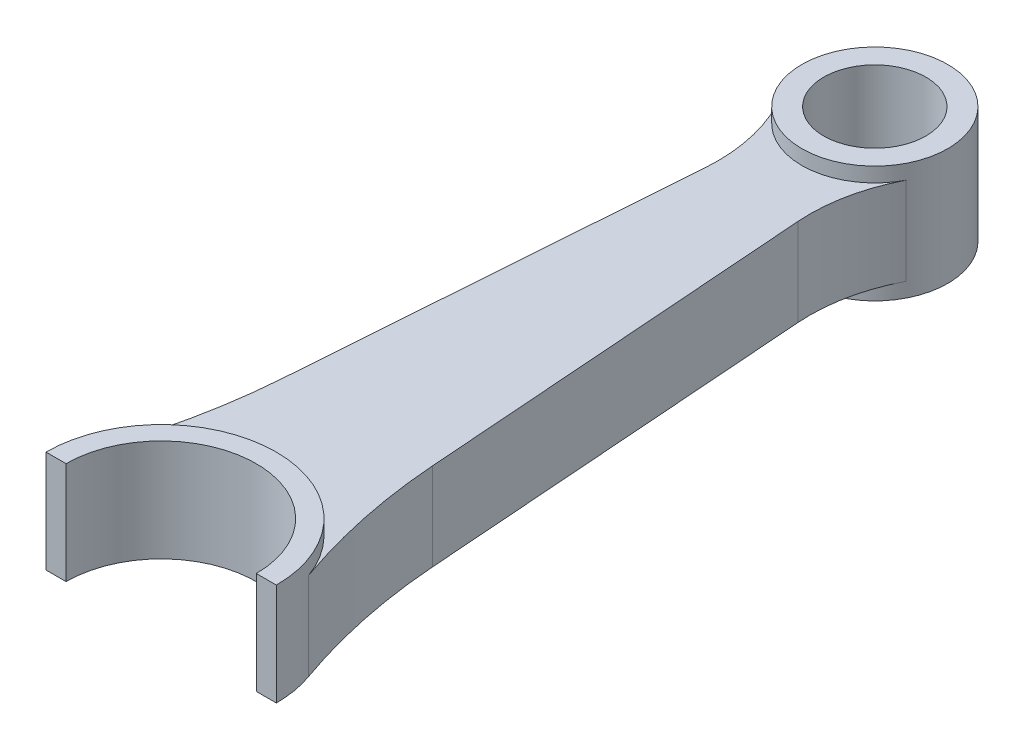
ISO-10303-21;
HEADER;
FILE_DESCRIPTION(('STEP AP214'),'2;1');
FILE_NAME('part.step','',(''),(''),'','','');
FILE_SCHEMA(('AUTOMOTIVE_DESIGN { 1 0 10303 214 1 1 1 1 }'));
ENDSEC;
DATA;
#1=APPLICATION_CONTEXT('core data for automotive mechanical design processes');
#2=APPLICATION_PROTOCOL_DEFINITION('international standard','automotive_design',2000,#1);
#3=PRODUCT_CONTEXT('',#1,'mechanical');
#4=PRODUCT('Part','Part','',(#3));
#5=PRODUCT_RELATED_PRODUCT_CATEGORY('part','',(#4));
#6=PRODUCT_DEFINITION_FORMATION('','',#4);
#7=PRODUCT_DEFINITION_CONTEXT('part definition',#1,'design');
#8=PRODUCT_DEFINITION('design','',#6,#7);
#9=PRODUCT_DEFINITION_SHAPE('','',#8);
#10=(LENGTH_UNIT() NAMED_UNIT(*) SI_UNIT(.MILLI.,.METRE.));
#11=(NAMED_UNIT(*) PLANE_ANGLE_UNIT() SI_UNIT($,.RADIAN.));
#12=(NAMED_UNIT(*) SI_UNIT($,.STERADIAN.) SOLID_ANGLE_UNIT());
#13=UNCERTAINTY_MEASURE_WITH_UNIT(LENGTH_MEASURE(1.E-05),#10,'distance_accuracy_value','');
#14=(GEOMETRIC_REPRESENTATION_CONTEXT(3) GLOBAL_UNCERTAINTY_ASSIGNED_CONTEXT((#13)) GLOBAL_UNIT_ASSIGNED_CONTEXT((#10,
#11,#12)) REPRESENTATION_CONTEXT('',''));
#15=CARTESIAN_POINT('',(0.,0.,0.));
#16=DIRECTION('',(0.,0.,1.));
#17=DIRECTION('',(1.,0.,0.));
#18=AXIS2_PLACEMENT_3D('',#15,#16,#17);
#19=CARTESIAN_POINT('',(0.,3.,0.));
#20=DIRECTION('',(0.,1.,0.));
#21=DIRECTION('',(0.,0.,1.));
#22=AXIS2_PLACEMENT_3D('',#19,#20,#21);
#23=PLANE('',#22);
#24=CARTESIAN_POINT('',(-46.2676943878692,3.,32.4495738727453));
#25=DIRECTION('',(0.,1.,0.));
#26=DIRECTION('',(0.,0.,1.));
#27=AXIS2_PLACEMENT_3D('',#24,#25,#26);
#28=CIRCLE('',#27,41.2123461748534);
#29=CARTESIAN_POINT('',(-5.16600758923558,3.,35.4676559695388));
#30=VERTEX_POINT('',#29);
#31=CARTESIAN_POINT('',(-7.43504926891974,3.,46.2511372009223));
#32=VERTEX_POINT('',#31);
#33=EDGE_CURVE('E181',#30,#32,#28,.F.);
#34=ORIENTED_EDGE('',*,*,#33,.T.);
#35=CARTESIAN_POINT('',(0.,3.,48.8936381950932));
#36=DIRECTION('',(0.,1.,0.));
#37=DIRECTION('',(0.,0.,1.));
#38=AXIS2_PLACEMENT_3D('',#35,#36,#37);
#39=CIRCLE('',#38,7.89067608861614);
#40=CARTESIAN_POINT('',(7.43504926891975,3.,46.2511372009223));
#41=VERTEX_POINT('',#40);
#42=EDGE_CURVE('E11',#32,#41,#39,.F.);
#43=ORIENTED_EDGE('',*,*,#42,.T.);
#44=CARTESIAN_POINT('',(46.2676943878693,3.,32.4495738727453));
#45=DIRECTION('',(0.,1.,0.));
#46=DIRECTION('',(0.,0.,1.));
#47=AXIS2_PLACEMENT_3D('',#44,#45,#46);
#48=CIRCLE('',#47,41.2123461748534);
#49=CARTESIAN_POINT('',(5.16600758923572,3.,35.4676559695389));
#50=VERTEX_POINT('',#49);
#51=EDGE_CURVE('E184',#50,#41,#48,.T.);
#52=ORIENTED_EDGE('',*,*,#51,.F.);
#53=DIRECTION('',(0.0732324746567138,0.,0.997314897439948));
#54=VECTOR('',#53,1.);
#55=CARTESIAN_POINT('',(2.54789234067379,3.,-0.187090819304305));
#56=LINE('',#55,#54);
#57=CARTESIAN_POINT('',(3.18274456382503,3.,8.45863066955105));
#58=VERTEX_POINT('',#57);
#59=EDGE_CURVE('E188',#58,#50,#56,.T.);
#60=ORIENTED_EDGE('',*,*,#59,.F.);
#61=CARTESIAN_POINT('',(14.741104148824,3.,7.60990447729783));
#62=DIRECTION('',(0.,1.,0.));
#63=DIRECTION('',(0.,0.,1.));
#64=AXIS2_PLACEMENT_3D('',#61,#62,#63);
#65=CIRCLE('',#64,11.5894785234519);
#66=CARTESIAN_POINT('',(4.4429076320829,3.,2.2935936372382));
#67=VERTEX_POINT('',#66);
#68=EDGE_CURVE('E192',#58,#67,#65,.F.);
#69=ORIENTED_EDGE('',*,*,#68,.T.);
#70=CARTESIAN_POINT('',(0.,3.,0.));
#71=DIRECTION('',(0.,1.,0.));
#72=DIRECTION('',(0.,0.,1.));
#73=AXIS2_PLACEMENT_3D('',#70,#71,#72);
#74=CIRCLE('',#73,5.);
#75=CARTESIAN_POINT('',(-4.44290763208289,3.,2.2935936372382));
#76=VERTEX_POINT('',#75);
#77=EDGE_CURVE('E170',#76,#67,#74,.T.);
#78=ORIENTED_EDGE('',*,*,#77,.F.);
#79=CARTESIAN_POINT('',(-14.741104148824,3.,7.60990447729783));
#80=DIRECTION('',(0.,1.,0.));
#81=DIRECTION('',(0.,0.,1.));
#82=AXIS2_PLACEMENT_3D('',#79,#80,#81);
#83=CIRCLE('',#82,11.5894785234519);
#84=CARTESIAN_POINT('',(-3.18274456382502,3.,8.458630669551));
#85=VERTEX_POINT('',#84);
#86=EDGE_CURVE('E173',#85,#76,#83,.T.);
#87=ORIENTED_EDGE('',*,*,#86,.F.);
#88=DIRECTION('',(-0.0732324746567093,0.,0.997314897439948));
#89=VECTOR('',#88,1.);
#90=CARTESIAN_POINT('',(-2.54789234067382,3.,-0.187090819304295));
#91=LINE('',#90,#89);
#92=EDGE_CURVE('E178',#85,#30,#91,.T.);
#93=ORIENTED_EDGE('',*,*,#92,.T.);
#94=EDGE_LOOP('',(#34,#43,#52,#60,#69,#78,#87,#93));
#95=FACE_BOUND('',#94,.T.);
#96=ADVANCED_FACE('F49',(#95),#23,.T.);
#97=CARTESIAN_POINT('',(0.,3.,48.8936381950932));
#98=DIRECTION('',(0.,0.,-1.));
#99=DIRECTION('',(-1.,0.,0.));
#100=AXIS2_PLACEMENT_3D('',#97,#98,#99);
#101=PLANE('',#100);
#102=DIRECTION('',(0.,-1.,0.));
#103=VECTOR('',#102,1.);
#104=CARTESIAN_POINT('',(-7.89067608861614,3.,48.8936381950932));
#105=LINE('',#104,#103);
#106=CARTESIAN_POINT('',(-7.89067608861614,4.,48.8936381950932));
#107=VERTEX_POINT('',#106);
#108=CARTESIAN_POINT('',(-7.89067608861614,-3.,48.8936381950932));
#109=VERTEX_POINT('',#108);
#110=EDGE_CURVE('E245',#107,#109,#105,.T.);
#111=ORIENTED_EDGE('',*,*,#110,.T.);
#112=DIRECTION('',(1.,0.,0.));
#113=VECTOR('',#112,1.);
#114=CARTESIAN_POINT('',(0.,-3.,48.8936381950932));
#115=LINE('',#114,#113);
#116=CARTESIAN_POINT('',(-6.51708949131695,-3.,48.8936381950932));
#117=VERTEX_POINT('',#116);
#118=EDGE_CURVE('E217',#109,#117,#115,.T.);
#119=ORIENTED_EDGE('',*,*,#118,.T.);
#120=DIRECTION('',(0.,1.,0.));
#121=VECTOR('',#120,1.);
#122=CARTESIAN_POINT('',(-6.51708949131695,-4.,48.8936381950932));
#123=LINE('',#122,#121);
#124=CARTESIAN_POINT('',(-6.51708949131695,4.,48.8936381950932));
#125=VERTEX_POINT('',#124);
#126=EDGE_CURVE('E65',#117,#125,#123,.T.);
#127=ORIENTED_EDGE('',*,*,#126,.T.);
#128=DIRECTION('',(1.,0.,0.));
#129=VECTOR('',#128,1.);
#130=CARTESIAN_POINT('',(-6.51708949131695,4.,48.8936381950932));
#131=LINE('',#130,#129);
#132=EDGE_CURVE('E160',#107,#125,#131,.T.);
#133=ORIENTED_EDGE('',*,*,#132,.F.);
#134=EDGE_LOOP('',(#111,#119,#127,#133));
#135=FACE_BOUND('',#134,.T.);
#136=ADVANCED_FACE('F282',(#135),#101,.F.);
#137=CARTESIAN_POINT('',(0.,4.,0.));
#138=DIRECTION('',(0.,1.,0.));
#139=DIRECTION('',(0.,0.,1.));
#140=AXIS2_PLACEMENT_3D('',#137,#138,#139);
#141=PLANE('',#140);
#142=CARTESIAN_POINT('',(0.,4.,0.));
#143=DIRECTION('',(0.,1.,0.));
#144=DIRECTION('',(0.,0.,1.));
#145=AXIS2_PLACEMENT_3D('',#142,#143,#144);
#146=CIRCLE('',#145,5.);
#147=CARTESIAN_POINT('',(0.,4.,5.));
#148=VERTEX_POINT('',#147);
#149=EDGE_CURVE('E269',#148,#148,#146,.T.);
#150=ORIENTED_EDGE('',*,*,#149,.T.);
#151=EDGE_LOOP('',(#150));
#152=FACE_BOUND('',#151,.T.);
#153=CARTESIAN_POINT('',(0.,4.,0.));
#154=DIRECTION('',(0.,1.,0.));
#155=DIRECTION('',(0.,0.,1.));
#156=AXIS2_PLACEMENT_3D('',#153,#154,#155);
#157=CIRCLE('',#156,3.5);
#158=CARTESIAN_POINT('',(0.,4.,3.5));
#159=VERTEX_POINT('',#158);
#160=EDGE_CURVE('E261',#159,#159,#157,.T.);
#161=ORIENTED_EDGE('',*,*,#160,.F.);
#162=EDGE_LOOP('',(#161));
#163=FACE_BOUND('',#162,.T.);
#164=ADVANCED_FACE('F325',(#152,#163),#141,.T.);
#165=CARTESIAN_POINT('',(0.,-4.,0.));
#166=DIRECTION('',(0.,1.,0.));
#167=DIRECTION('',(0.,0.,1.));
#168=AXIS2_PLACEMENT_3D('',#165,#166,#167);
#169=PLANE('',#168);
#170=CARTESIAN_POINT('',(0.,-4.,0.));
#171=DIRECTION('',(0.,1.,0.));
#172=DIRECTION('',(0.,0.,1.));
#173=AXIS2_PLACEMENT_3D('',#170,#171,#172);
#174=CIRCLE('',#173,5.);
#175=CARTESIAN_POINT('',(0.,-4.,5.));
#176=VERTEX_POINT('',#175);
#177=EDGE_CURVE('E265',#176,#176,#174,.T.);
#178=ORIENTED_EDGE('',*,*,#177,.F.);
#179=EDGE_LOOP('',(#178));
#180=FACE_BOUND('',#179,.T.);
#181=CARTESIAN_POINT('',(0.,-4.,0.));
#182=DIRECTION('',(0.,1.,0.));
#183=DIRECTION('',(0.,0.,1.));
#184=AXIS2_PLACEMENT_3D('',#181,#182,#183);
#185=CIRCLE('',#184,3.5);
#186=CARTESIAN_POINT('',(0.,-4.,3.5));
#187=VERTEX_POINT('',#186);
#188=EDGE_CURVE('E260',#187,#187,#185,.T.);
#189=ORIENTED_EDGE('',*,*,#188,.T.);
#190=EDGE_LOOP('',(#189));
#191=FACE_BOUND('',#190,.T.);
#192=ADVANCED_FACE('F351',(#180,#191),#169,.F.);
#193=CARTESIAN_POINT('',(0.,4.,0.));
#194=DIRECTION('',(0.,-1.,0.));
#195=DIRECTION('',(0.,0.,-1.));
#196=AXIS2_PLACEMENT_3D('',#193,#194,#195);
#197=CYLINDRICAL_SURFACE('',#196,5.);
#198=DIRECTION('',(0.,-1.,0.));
#199=VECTOR('',#198,1.);
#200=CARTESIAN_POINT('',(-4.44290763208289,3.,2.2935936372382));
#201=LINE('',#200,#199);
#202=CARTESIAN_POINT('',(-4.4429076320829,-3.,2.2935936372382));
#203=VERTEX_POINT('',#202);
#204=EDGE_CURVE('E73',#76,#203,#201,.T.);
#205=ORIENTED_EDGE('',*,*,#204,.F.);
#206=ORIENTED_EDGE('',*,*,#77,.T.);
#207=DIRECTION('',(0.,-1.,0.));
#208=VECTOR('',#207,1.);
#209=CARTESIAN_POINT('',(4.44290763208289,3.,2.29359363723821));
#210=LINE('',#209,#208);
#211=CARTESIAN_POINT('',(4.44290763208289,-3.,2.29359363723821));
#212=VERTEX_POINT('',#211);
#213=EDGE_CURVE('E196',#67,#212,#210,.T.);
#214=ORIENTED_EDGE('',*,*,#213,.T.);
#215=CARTESIAN_POINT('',(0.,-3.,0.));
#216=DIRECTION('',(0.,1.,0.));
#217=DIRECTION('',(0.,0.,1.));
#218=AXIS2_PLACEMENT_3D('',#215,#216,#217);
#219=CIRCLE('',#218,5.);
#220=EDGE_CURVE('E145',#203,#212,#219,.T.);
#221=ORIENTED_EDGE('',*,*,#220,.F.);
#222=EDGE_LOOP('',(#205,#206,#214,#221));
#223=FACE_BOUND('',#222,.T.);
#224=ORIENTED_EDGE('',*,*,#149,.F.);
#225=EDGE_LOOP('',(#224));
#226=FACE_BOUND('',#225,.T.);
#227=ORIENTED_EDGE('',*,*,#177,.T.);
#228=EDGE_LOOP('',(#227));
#229=FACE_BOUND('',#228,.T.);
#230=ADVANCED_FACE('F51',(#223,#226,#229),#197,.T.);
#231=CARTESIAN_POINT('',(0.,4.,0.));
#232=DIRECTION('',(0.,-1.,0.));
#233=DIRECTION('',(0.,0.,-1.));
#234=AXIS2_PLACEMENT_3D('',#231,#232,#233);
#235=CYLINDRICAL_SURFACE('',#234,3.5);
#236=ORIENTED_EDGE('',*,*,#160,.T.);
#237=EDGE_LOOP('',(#236));
#238=FACE_BOUND('',#237,.T.);
#239=ORIENTED_EDGE('',*,*,#188,.F.);
#240=EDGE_LOOP('',(#239));
#241=FACE_BOUND('',#240,.T.);
#242=ADVANCED_FACE('F346',(#238,#241),#235,.F.);
#243=CARTESIAN_POINT('',(-14.741104148824,3.,7.60990447729783));
#244=DIRECTION('',(0.,-1.,0.));
#245=DIRECTION('',(0.,0.,-1.));
#246=AXIS2_PLACEMENT_3D('',#243,#244,#245);
#247=CYLINDRICAL_SURFACE('',#246,11.5894785234519);
#248=CARTESIAN_POINT('',(-14.741104148824,-3.,7.60990447729783));
#249=DIRECTION('',(0.,1.,0.));
#250=DIRECTION('',(0.,0.,1.));
#251=AXIS2_PLACEMENT_3D('',#248,#249,#250);
#252=CIRCLE('',#251,11.5894785234519);
#253=CARTESIAN_POINT('',(-3.18274456382502,-3.,8.458630669551));
#254=VERTEX_POINT('',#253);
#255=EDGE_CURVE('E200',#254,#203,#252,.T.);
#256=ORIENTED_EDGE('',*,*,#255,.F.);
#257=DIRECTION('',(0.,-1.,0.));
#258=VECTOR('',#257,1.);
#259=CARTESIAN_POINT('',(-3.18274456382502,3.,8.458630669551));
#260=LINE('',#259,#258);
#261=EDGE_CURVE('E255',#85,#254,#260,.T.);
#262=ORIENTED_EDGE('',*,*,#261,.F.);
#263=ORIENTED_EDGE('',*,*,#86,.T.);
#264=ORIENTED_EDGE('',*,*,#204,.T.);
#265=EDGE_LOOP('',(#256,#262,#263,#264));
#266=FACE_BOUND('',#265,.T.);
#267=ADVANCED_FACE('F299',(#266),#247,.F.);
#268=CARTESIAN_POINT('',(-2.54789234067382,3.,-0.187090819304295));
#269=DIRECTION('',(0.997314897439948,0.,0.0732324746567093));
#270=DIRECTION('',(0.0732324746567093,0.,-0.997314897439948));
#271=AXIS2_PLACEMENT_3D('',#268,#269,#270);
#272=PLANE('',#271);
#273=DIRECTION('',(-0.0732324746567093,0.,0.997314897439948));
#274=VECTOR('',#273,1.);
#275=CARTESIAN_POINT('',(-2.54789234067382,-3.,-0.187090819304295));
#276=LINE('',#275,#274);
#277=CARTESIAN_POINT('',(-5.16600758923558,-3.,35.4676559695388));
#278=VERTEX_POINT('',#277);
#279=EDGE_CURVE('E204',#254,#278,#276,.T.);
#280=ORIENTED_EDGE('',*,*,#279,.T.);
#281=DIRECTION('',(0.,-1.,0.));
#282=VECTOR('',#281,1.);
#283=CARTESIAN_POINT('',(-5.16600758923558,3.,35.4676559695388));
#284=LINE('',#283,#282);
#285=EDGE_CURVE('E251',#30,#278,#284,.T.);
#286=ORIENTED_EDGE('',*,*,#285,.F.);
#287=ORIENTED_EDGE('',*,*,#92,.F.);
#288=ORIENTED_EDGE('',*,*,#261,.T.);
#289=EDGE_LOOP('',(#280,#286,#287,#288));
#290=FACE_BOUND('',#289,.T.);
#291=ADVANCED_FACE('F296',(#290),#272,.F.);
#292=CARTESIAN_POINT('',(-46.2676943878692,3.,32.4495738727453));
#293=DIRECTION('',(0.,-1.,0.));
#294=DIRECTION('',(0.,0.,-1.));
#295=AXIS2_PLACEMENT_3D('',#292,#293,#294);
#296=CYLINDRICAL_SURFACE('',#295,41.2123461748534);
#297=CARTESIAN_POINT('',(-46.2676943878692,-3.,32.4495738727453));
#298=DIRECTION('',(0.,1.,0.));
#299=DIRECTION('',(0.,0.,1.));
#300=AXIS2_PLACEMENT_3D('',#297,#298,#299);
#301=CIRCLE('',#300,41.2123461748534);
#302=CARTESIAN_POINT('',(-7.43504926891974,-3.,46.2511372009223));
#303=VERTEX_POINT('',#302);
#304=EDGE_CURVE('E207',#278,#303,#301,.F.);
#305=ORIENTED_EDGE('',*,*,#304,.T.);
#306=DIRECTION('',(0.,-1.,0.));
#307=VECTOR('',#306,1.);
#308=CARTESIAN_POINT('',(-7.43504926891974,3.,46.2511372009223));
#309=LINE('',#308,#307);
#310=EDGE_CURVE('E248',#32,#303,#309,.T.);
#311=ORIENTED_EDGE('',*,*,#310,.F.);
#312=ORIENTED_EDGE('',*,*,#33,.F.);
#313=ORIENTED_EDGE('',*,*,#285,.T.);
#314=EDGE_LOOP('',(#305,#311,#312,#313));
#315=FACE_BOUND('',#314,.T.);
#316=ADVANCED_FACE('F291',(#315),#296,.F.);
#317=CARTESIAN_POINT('',(0.,3.,48.8936381950932));
#318=DIRECTION('',(0.,-1.,0.));
#319=DIRECTION('',(0.,0.,-1.));
#320=AXIS2_PLACEMENT_3D('',#317,#318,#319);
#321=CYLINDRICAL_SURFACE('',#320,7.89067608861614);
#322=ORIENTED_EDGE('',*,*,#310,.T.);
#323=CARTESIAN_POINT('',(0.,-3.,48.8936381950932));
#324=DIRECTION('',(0.,1.,0.));
#325=DIRECTION('',(0.,0.,1.));
#326=AXIS2_PLACEMENT_3D('',#323,#324,#325);
#327=CIRCLE('',#326,7.89067608861614);
#328=EDGE_CURVE('E211',#303,#109,#327,.T.);
#329=ORIENTED_EDGE('',*,*,#328,.T.);
#330=ORIENTED_EDGE('',*,*,#110,.F.);
#331=CARTESIAN_POINT('',(0.,4.,48.8936381950932));
#332=DIRECTION('',(0.,1.,0.));
#333=DIRECTION('',(0.,0.,1.));
#334=AXIS2_PLACEMENT_3D('',#331,#332,#333);
#335=CIRCLE('',#334,7.89067608861614);
#336=CARTESIAN_POINT('',(7.89067608861615,4.,48.8936381950932));
#337=VERTEX_POINT('',#336);
#338=EDGE_CURVE('E155',#337,#107,#335,.T.);
#339=ORIENTED_EDGE('',*,*,#338,.F.);
#340=DIRECTION('',(0.,-1.,0.));
#341=VECTOR('',#340,1.);
#342=CARTESIAN_POINT('',(7.89067608861615,3.,48.8936381950932));
#343=LINE('',#342,#341);
#344=CARTESIAN_POINT('',(7.89067608861615,-3.,48.8936381950932));
#345=VERTEX_POINT('',#344);
#346=EDGE_CURVE('E150',#337,#345,#343,.T.);
#347=ORIENTED_EDGE('',*,*,#346,.T.);
#348=CARTESIAN_POINT('',(7.43504926891975,-3.,46.2511372009223));
#349=VERTEX_POINT('',#348);
#350=EDGE_CURVE('E216',#345,#349,#327,.T.);
#351=ORIENTED_EDGE('',*,*,#350,.T.);
#352=DIRECTION('',(0.,-1.,0.));
#353=VECTOR('',#352,1.);
#354=CARTESIAN_POINT('',(7.43504926891975,3.,46.2511372009223));
#355=LINE('',#354,#353);
#356=EDGE_CURVE('E240',#41,#349,#355,.T.);
#357=ORIENTED_EDGE('',*,*,#356,.F.);
#358=ORIENTED_EDGE('',*,*,#42,.F.);
#359=EDGE_LOOP('',(#322,#329,#330,#339,#347,#351,#357,#358));
#360=FACE_BOUND('',#359,.T.);
#361=ADVANCED_FACE('F284',(#360),#321,.T.);
#362=DIRECTION('',(1.,0.,0.));
#363=VECTOR('',#362,1.);
#364=CARTESIAN_POINT('',(6.51708949131697,4.,48.8936381950932));
#365=LINE('',#364,#363);
#366=CARTESIAN_POINT('',(6.51708949131697,4.,48.8936381950932));
#367=VERTEX_POINT('',#366);
#368=EDGE_CURVE('E148',#367,#337,#365,.T.);
#369=ORIENTED_EDGE('',*,*,#368,.F.);
#370=DIRECTION('',(0.,1.,0.));
#371=VECTOR('',#370,1.);
#372=CARTESIAN_POINT('',(6.51708949131696,-4.,48.8936381950932));
#373=LINE('',#372,#371);
#374=CARTESIAN_POINT('',(6.51708949131696,-3.,48.8936381950932));
#375=VERTEX_POINT('',#374);
#376=EDGE_CURVE('E136',#375,#367,#373,.T.);
#377=ORIENTED_EDGE('',*,*,#376,.F.);
#378=EDGE_CURVE('E215',#375,#345,#115,.T.);
#379=ORIENTED_EDGE('',*,*,#378,.T.);
#380=ORIENTED_EDGE('',*,*,#346,.F.);
#381=EDGE_LOOP('',(#369,#377,#379,#380));
#382=FACE_BOUND('',#381,.T.);
#383=ADVANCED_FACE('F149',(#382),#101,.F.);
#384=CARTESIAN_POINT('',(46.2676943878693,3.,32.4495738727453));
#385=DIRECTION('',(0.,-1.,0.));
#386=DIRECTION('',(0.,0.,-1.));
#387=AXIS2_PLACEMENT_3D('',#384,#385,#386);
#388=CYLINDRICAL_SURFACE('',#387,41.2123461748534);
#389=CARTESIAN_POINT('',(46.2676943878693,-3.,32.4495738727453));
#390=DIRECTION('',(0.,1.,0.));
#391=DIRECTION('',(0.,0.,1.));
#392=AXIS2_PLACEMENT_3D('',#389,#390,#391);
#393=CIRCLE('',#392,41.2123461748534);
#394=CARTESIAN_POINT('',(5.16600758923572,-3.,35.4676559695389));
#395=VERTEX_POINT('',#394);
#396=EDGE_CURVE('E221',#395,#349,#393,.T.);
#397=ORIENTED_EDGE('',*,*,#396,.F.);
#398=DIRECTION('',(0.,-1.,0.));
#399=VECTOR('',#398,1.);
#400=CARTESIAN_POINT('',(5.16600758923572,3.,35.4676559695389));
#401=LINE('',#400,#399);
#402=EDGE_CURVE('E237',#50,#395,#401,.T.);
#403=ORIENTED_EDGE('',*,*,#402,.F.);
#404=ORIENTED_EDGE('',*,*,#51,.T.);
#405=ORIENTED_EDGE('',*,*,#356,.T.);
#406=EDGE_LOOP('',(#397,#403,#404,#405));
#407=FACE_BOUND('',#406,.T.);
#408=ADVANCED_FACE('F313',(#407),#388,.F.);
#409=CARTESIAN_POINT('',(2.54789234067379,3.,-0.187090819304305));
#410=DIRECTION('',(0.997314897439948,0.,-0.0732324746567138));
#411=DIRECTION('',(-0.0732324746567138,0.,-0.997314897439948));
#412=AXIS2_PLACEMENT_3D('',#409,#410,#411);
#413=PLANE('',#412);
#414=DIRECTION('',(0.0732324746567138,0.,0.997314897439948));
#415=VECTOR('',#414,1.);
#416=CARTESIAN_POINT('',(2.54789234067379,-3.,-0.187090819304305));
#417=LINE('',#416,#415);
#418=CARTESIAN_POINT('',(3.18274456382503,-3.,8.45863066955105));
#419=VERTEX_POINT('',#418);
#420=EDGE_CURVE('E225',#419,#395,#417,.T.);
#421=ORIENTED_EDGE('',*,*,#420,.F.);
#422=DIRECTION('',(0.,-1.,0.));
#423=VECTOR('',#422,1.);
#424=CARTESIAN_POINT('',(3.18274456382503,3.,8.45863066955105));
#425=LINE('',#424,#423);
#426=EDGE_CURVE('E234',#58,#419,#425,.T.);
#427=ORIENTED_EDGE('',*,*,#426,.F.);
#428=ORIENTED_EDGE('',*,*,#59,.T.);
#429=ORIENTED_EDGE('',*,*,#402,.T.);
#430=EDGE_LOOP('',(#421,#427,#428,#429));
#431=FACE_BOUND('',#430,.T.);
#432=ADVANCED_FACE('F309',(#431),#413,.T.);
#433=CARTESIAN_POINT('',(14.741104148824,3.,7.60990447729783));
#434=DIRECTION('',(0.,-1.,0.));
#435=DIRECTION('',(0.,0.,-1.));
#436=AXIS2_PLACEMENT_3D('',#433,#434,#435);
#437=CYLINDRICAL_SURFACE('',#436,11.5894785234519);
#438=CARTESIAN_POINT('',(14.741104148824,-3.,7.60990447729783));
#439=DIRECTION('',(0.,1.,0.));
#440=DIRECTION('',(0.,0.,1.));
#441=AXIS2_PLACEMENT_3D('',#438,#439,#440);
#442=CIRCLE('',#441,11.5894785234519);
#443=EDGE_CURVE('E174',#419,#212,#442,.F.);
#444=ORIENTED_EDGE('',*,*,#443,.T.);
#445=ORIENTED_EDGE('',*,*,#213,.F.);
#446=ORIENTED_EDGE('',*,*,#68,.F.);
#447=ORIENTED_EDGE('',*,*,#426,.T.);
#448=EDGE_LOOP('',(#444,#445,#446,#447));
#449=FACE_BOUND('',#448,.T.);
#450=ADVANCED_FACE('F306',(#449),#437,.F.);
#451=CARTESIAN_POINT('',(0.,-3.,0.));
#452=DIRECTION('',(0.,1.,0.));
#453=DIRECTION('',(0.,0.,1.));
#454=AXIS2_PLACEMENT_3D('',#451,#452,#453);
#455=PLANE('',#454);
#456=ORIENTED_EDGE('',*,*,#378,.F.);
#457=CARTESIAN_POINT('',(0.,-3.,48.8936381950932));
#458=DIRECTION('',(0.,1.,0.));
#459=DIRECTION('',(0.,0.,1.));
#460=AXIS2_PLACEMENT_3D('',#457,#458,#459);
#461=CIRCLE('',#460,6.51708949131696);
#462=EDGE_CURVE('E58',#375,#117,#461,.T.);
#463=ORIENTED_EDGE('',*,*,#462,.T.);
#464=ORIENTED_EDGE('',*,*,#118,.F.);
#465=ORIENTED_EDGE('',*,*,#328,.F.);
#466=ORIENTED_EDGE('',*,*,#304,.F.);
#467=ORIENTED_EDGE('',*,*,#279,.F.);
#468=ORIENTED_EDGE('',*,*,#255,.T.);
#469=ORIENTED_EDGE('',*,*,#220,.T.);
#470=ORIENTED_EDGE('',*,*,#443,.F.);
#471=ORIENTED_EDGE('',*,*,#420,.T.);
#472=ORIENTED_EDGE('',*,*,#396,.T.);
#473=ORIENTED_EDGE('',*,*,#350,.F.);
#474=EDGE_LOOP('',(#456,#463,#464,#465,#466,#467,#468,#469,#470,#471,#472,#473));
#475=FACE_BOUND('',#474,.T.);
#476=ADVANCED_FACE('F278',(#475),#455,.F.);
#477=CARTESIAN_POINT('',(0.,-4.,48.8936381950932));
#478=DIRECTION('',(0.,1.,0.));
#479=DIRECTION('',(0.,0.,1.));
#480=AXIS2_PLACEMENT_3D('',#477,#478,#479);
#481=CYLINDRICAL_SURFACE('',#480,6.51708949131696);
#482=CARTESIAN_POINT('',(0.,4.,48.8936381950932));
#483=DIRECTION('',(0.,-1.,0.));
#484=DIRECTION('',(0.,0.,1.));
#485=AXIS2_PLACEMENT_3D('',#482,#483,#484);
#486=CIRCLE('',#485,6.51708949131696);
#487=EDGE_CURVE('E140',#125,#367,#486,.T.);
#488=ORIENTED_EDGE('',*,*,#487,.F.);
#489=ORIENTED_EDGE('',*,*,#126,.F.);
#490=ORIENTED_EDGE('',*,*,#462,.F.);
#491=ORIENTED_EDGE('',*,*,#376,.T.);
#492=EDGE_LOOP('',(#488,#489,#490,#491));
#493=FACE_BOUND('',#492,.T.);
#494=ADVANCED_FACE('F138',(#493),#481,.F.);
#495=CARTESIAN_POINT('',(0.,4.,48.8936381950932));
#496=DIRECTION('',(0.,1.,0.));
#497=DIRECTION('',(0.,0.,1.));
#498=AXIS2_PLACEMENT_3D('',#495,#496,#497);
#499=PLANE('',#498);
#500=ORIENTED_EDGE('',*,*,#487,.T.);
#501=ORIENTED_EDGE('',*,*,#368,.T.);
#502=ORIENTED_EDGE('',*,*,#338,.T.);
#503=ORIENTED_EDGE('',*,*,#132,.T.);
#504=EDGE_LOOP('',(#500,#501,#502,#503));
#505=FACE_BOUND('',#504,.T.);
#506=ADVANCED_FACE('F158',(#505),#499,.T.);
#507=CLOSED_SHELL('',(#96,#136,#164,#192,#230,#242,#267,#291,#316,#361,#383,#408,#432,#450,#476,
#494,#506));
#508=MANIFOLD_SOLID_BREP('B2',#507);
#509=ADVANCED_BREP_SHAPE_REPRESENTATION('',(#18,#508),#14);
#510=SHAPE_DEFINITION_REPRESENTATION(#9,#509);
ENDSEC;
END-ISO-10303-21;
